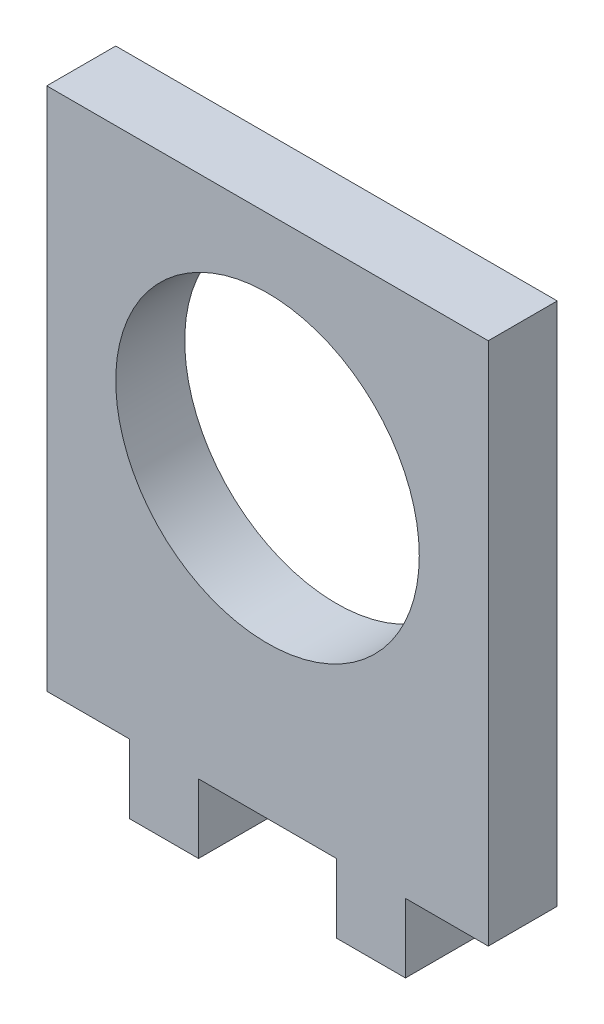
ISO-10303-21;
HEADER;
FILE_DESCRIPTION(('STEP AP214'),'2;1');
FILE_NAME('part.step','',(''),(''),'','','');
FILE_SCHEMA(('AUTOMOTIVE_DESIGN { 1 0 10303 214 1 1 1 1 }'));
ENDSEC;
DATA;
#1=APPLICATION_CONTEXT('core data for automotive mechanical design processes');
#2=APPLICATION_PROTOCOL_DEFINITION('international standard','automotive_design',2000,#1);
#3=PRODUCT_CONTEXT('',#1,'mechanical');
#4=PRODUCT('Part','Part','',(#3));
#5=PRODUCT_RELATED_PRODUCT_CATEGORY('part','',(#4));
#6=PRODUCT_DEFINITION_FORMATION('','',#4);
#7=PRODUCT_DEFINITION_CONTEXT('part definition',#1,'design');
#8=PRODUCT_DEFINITION('design','',#6,#7);
#9=PRODUCT_DEFINITION_SHAPE('','',#8);
#10=(LENGTH_UNIT() NAMED_UNIT(*) SI_UNIT(.MILLI.,.METRE.));
#11=(NAMED_UNIT(*) PLANE_ANGLE_UNIT() SI_UNIT($,.RADIAN.));
#12=(NAMED_UNIT(*) SI_UNIT($,.STERADIAN.) SOLID_ANGLE_UNIT());
#13=UNCERTAINTY_MEASURE_WITH_UNIT(LENGTH_MEASURE(1.E-05),#10,'distance_accuracy_value','');
#14=(GEOMETRIC_REPRESENTATION_CONTEXT(3) GLOBAL_UNCERTAINTY_ASSIGNED_CONTEXT((#13)) GLOBAL_UNIT_ASSIGNED_CONTEXT((#10,
#11,#12)) REPRESENTATION_CONTEXT('',''));
#15=CARTESIAN_POINT('',(0.,0.,0.));
#16=DIRECTION('',(0.,0.,1.));
#17=DIRECTION('',(1.,0.,0.));
#18=AXIS2_PLACEMENT_3D('',#15,#16,#17);
#19=CARTESIAN_POINT('',(0.,-27.,5.));
#20=DIRECTION('',(0.,1.,0.));
#21=DIRECTION('',(0.,0.,1.));
#22=AXIS2_PLACEMENT_3D('',#19,#20,#21);
#23=PLANE('',#22);
#24=DIRECTION('',(1.,0.,0.));
#25=VECTOR('',#24,1.);
#26=CARTESIAN_POINT('',(0.,-27.,0.));
#27=LINE('',#26,#25);
#28=CARTESIAN_POINT('',(5.,-27.,0.));
#29=VERTEX_POINT('',#28);
#30=CARTESIAN_POINT('',(10.,-27.,0.));
#31=VERTEX_POINT('',#30);
#32=EDGE_CURVE('E207',#29,#31,#27,.T.);
#33=ORIENTED_EDGE('',*,*,#32,.T.);
#34=DIRECTION('',(0.,0.,-1.));
#35=VECTOR('',#34,1.);
#36=CARTESIAN_POINT('',(10.,-27.,5.));
#37=LINE('',#36,#35);
#38=CARTESIAN_POINT('',(10.,-27.,5.));
#39=VERTEX_POINT('',#38);
#40=EDGE_CURVE('E11',#39,#31,#37,.T.);
#41=ORIENTED_EDGE('',*,*,#40,.F.);
#42=DIRECTION('',(1.,0.,0.));
#43=VECTOR('',#42,1.);
#44=CARTESIAN_POINT('',(0.,-27.,5.));
#45=LINE('',#44,#43);
#46=CARTESIAN_POINT('',(5.,-27.,5.));
#47=VERTEX_POINT('',#46);
#48=EDGE_CURVE('E162',#47,#39,#45,.T.);
#49=ORIENTED_EDGE('',*,*,#48,.F.);
#50=DIRECTION('',(0.,0.,-1.));
#51=VECTOR('',#50,1.);
#52=CARTESIAN_POINT('',(5.,-27.,5.));
#53=LINE('',#52,#51);
#54=EDGE_CURVE('E174',#47,#29,#53,.T.);
#55=ORIENTED_EDGE('',*,*,#54,.T.);
#56=EDGE_LOOP('',(#33,#41,#49,#55));
#57=FACE_BOUND('',#56,.T.);
#58=ADVANCED_FACE('F33',(#57),#23,.F.);
#59=CARTESIAN_POINT('',(10.,0.,5.));
#60=DIRECTION('',(-1.,0.,0.));
#61=DIRECTION('',(0.,0.,1.));
#62=AXIS2_PLACEMENT_3D('',#59,#60,#61);
#63=PLANE('',#62);
#64=DIRECTION('',(0.,1.,0.));
#65=VECTOR('',#64,1.);
#66=CARTESIAN_POINT('',(10.,0.,0.));
#67=LINE('',#66,#65);
#68=CARTESIAN_POINT('',(10.,-22.,0.));
#69=VERTEX_POINT('',#68);
#70=EDGE_CURVE('E199',#31,#69,#67,.T.);
#71=ORIENTED_EDGE('',*,*,#70,.T.);
#72=DIRECTION('',(0.,0.,-1.));
#73=VECTOR('',#72,1.);
#74=CARTESIAN_POINT('',(10.,-22.,5.));
#75=LINE('',#74,#73);
#76=CARTESIAN_POINT('',(10.,-22.,5.));
#77=VERTEX_POINT('',#76);
#78=EDGE_CURVE('E41',#77,#69,#75,.T.);
#79=ORIENTED_EDGE('',*,*,#78,.F.);
#80=DIRECTION('',(0.,1.,0.));
#81=VECTOR('',#80,1.);
#82=CARTESIAN_POINT('',(10.,0.,5.));
#83=LINE('',#82,#81);
#84=EDGE_CURVE('E104',#39,#77,#83,.T.);
#85=ORIENTED_EDGE('',*,*,#84,.F.);
#86=ORIENTED_EDGE('',*,*,#40,.T.);
#87=EDGE_LOOP('',(#71,#79,#85,#86));
#88=FACE_BOUND('',#87,.T.);
#89=ADVANCED_FACE('F259',(#88),#63,.F.);
#90=CARTESIAN_POINT('',(0.,-22.,5.));
#91=DIRECTION('',(0.,1.,0.));
#92=DIRECTION('',(0.,0.,1.));
#93=AXIS2_PLACEMENT_3D('',#90,#91,#92);
#94=PLANE('',#93);
#95=DIRECTION('',(1.,0.,0.));
#96=VECTOR('',#95,1.);
#97=CARTESIAN_POINT('',(0.,-22.,0.));
#98=LINE('',#97,#96);
#99=CARTESIAN_POINT('',(16.,-22.,0.));
#100=VERTEX_POINT('',#99);
#101=EDGE_CURVE('E194',#69,#100,#98,.T.);
#102=ORIENTED_EDGE('',*,*,#101,.T.);
#103=DIRECTION('',(0.,0.,-1.));
#104=VECTOR('',#103,1.);
#105=CARTESIAN_POINT('',(16.,-22.,5.));
#106=LINE('',#105,#104);
#107=CARTESIAN_POINT('',(16.,-22.,5.));
#108=VERTEX_POINT('',#107);
#109=EDGE_CURVE('E188',#108,#100,#106,.T.);
#110=ORIENTED_EDGE('',*,*,#109,.F.);
#111=DIRECTION('',(1.,0.,0.));
#112=VECTOR('',#111,1.);
#113=CARTESIAN_POINT('',(0.,-22.,5.));
#114=LINE('',#113,#112);
#115=EDGE_CURVE('E151',#77,#108,#114,.T.);
#116=ORIENTED_EDGE('',*,*,#115,.F.);
#117=ORIENTED_EDGE('',*,*,#78,.T.);
#118=EDGE_LOOP('',(#102,#110,#116,#117));
#119=FACE_BOUND('',#118,.T.);
#120=ADVANCED_FACE('F193',(#119),#94,.F.);
#121=CARTESIAN_POINT('',(16.,0.,5.));
#122=DIRECTION('',(-1.,0.,0.));
#123=DIRECTION('',(0.,0.,1.));
#124=AXIS2_PLACEMENT_3D('',#121,#122,#123);
#125=PLANE('',#124);
#126=DIRECTION('',(0.,1.,0.));
#127=VECTOR('',#126,1.);
#128=CARTESIAN_POINT('',(16.,0.,0.));
#129=LINE('',#128,#127);
#130=CARTESIAN_POINT('',(16.,16.,0.));
#131=VERTEX_POINT('',#130);
#132=EDGE_CURVE('E202',#100,#131,#129,.T.);
#133=ORIENTED_EDGE('',*,*,#132,.T.);
#134=DIRECTION('',(0.,0.,-1.));
#135=VECTOR('',#134,1.);
#136=CARTESIAN_POINT('',(16.,16.,5.));
#137=LINE('',#136,#135);
#138=CARTESIAN_POINT('',(16.,16.,5.));
#139=VERTEX_POINT('',#138);
#140=EDGE_CURVE('E186',#139,#131,#137,.T.);
#141=ORIENTED_EDGE('',*,*,#140,.F.);
#142=DIRECTION('',(0.,1.,0.));
#143=VECTOR('',#142,1.);
#144=CARTESIAN_POINT('',(16.,0.,5.));
#145=LINE('',#144,#143);
#146=EDGE_CURVE('E158',#108,#139,#145,.T.);
#147=ORIENTED_EDGE('',*,*,#146,.F.);
#148=ORIENTED_EDGE('',*,*,#109,.T.);
#149=EDGE_LOOP('',(#133,#141,#147,#148));
#150=FACE_BOUND('',#149,.T.);
#151=ADVANCED_FACE('F266',(#150),#125,.F.);
#152=CARTESIAN_POINT('',(0.,16.,5.));
#153=DIRECTION('',(0.,1.,0.));
#154=DIRECTION('',(0.,0.,1.));
#155=AXIS2_PLACEMENT_3D('',#152,#153,#154);
#156=PLANE('',#155);
#157=DIRECTION('',(1.,0.,0.));
#158=VECTOR('',#157,1.);
#159=CARTESIAN_POINT('',(0.,16.,0.));
#160=LINE('',#159,#158);
#161=CARTESIAN_POINT('',(-16.,16.,0.));
#162=VERTEX_POINT('',#161);
#163=EDGE_CURVE('E205',#162,#131,#160,.T.);
#164=ORIENTED_EDGE('',*,*,#163,.F.);
#165=DIRECTION('',(0.,0.,-1.));
#166=VECTOR('',#165,1.);
#167=CARTESIAN_POINT('',(-16.,16.,5.));
#168=LINE('',#167,#166);
#169=CARTESIAN_POINT('',(-16.,16.,5.));
#170=VERTEX_POINT('',#169);
#171=EDGE_CURVE('E184',#170,#162,#168,.T.);
#172=ORIENTED_EDGE('',*,*,#171,.F.);
#173=DIRECTION('',(1.,0.,0.));
#174=VECTOR('',#173,1.);
#175=CARTESIAN_POINT('',(0.,16.,5.));
#176=LINE('',#175,#174);
#177=EDGE_CURVE('E161',#170,#139,#176,.T.);
#178=ORIENTED_EDGE('',*,*,#177,.T.);
#179=ORIENTED_EDGE('',*,*,#140,.T.);
#180=EDGE_LOOP('',(#164,#172,#178,#179));
#181=FACE_BOUND('',#180,.T.);
#182=ADVANCED_FACE('F270',(#181),#156,.T.);
#183=CARTESIAN_POINT('',(-16.,0.,5.));
#184=DIRECTION('',(-1.,0.,0.));
#185=DIRECTION('',(0.,0.,1.));
#186=AXIS2_PLACEMENT_3D('',#183,#184,#185);
#187=PLANE('',#186);
#188=DIRECTION('',(0.,1.,0.));
#189=VECTOR('',#188,1.);
#190=CARTESIAN_POINT('',(-16.,0.,0.));
#191=LINE('',#190,#189);
#192=CARTESIAN_POINT('',(-16.,-22.,0.));
#193=VERTEX_POINT('',#192);
#194=EDGE_CURVE('E211',#193,#162,#191,.T.);
#195=ORIENTED_EDGE('',*,*,#194,.F.);
#196=DIRECTION('',(0.,0.,-1.));
#197=VECTOR('',#196,1.);
#198=CARTESIAN_POINT('',(-16.,-22.,5.));
#199=LINE('',#198,#197);
#200=CARTESIAN_POINT('',(-16.,-22.,5.));
#201=VERTEX_POINT('',#200);
#202=EDGE_CURVE('E182',#201,#193,#199,.T.);
#203=ORIENTED_EDGE('',*,*,#202,.F.);
#204=DIRECTION('',(0.,1.,0.));
#205=VECTOR('',#204,1.);
#206=CARTESIAN_POINT('',(-16.,0.,5.));
#207=LINE('',#206,#205);
#208=EDGE_CURVE('E157',#201,#170,#207,.T.);
#209=ORIENTED_EDGE('',*,*,#208,.T.);
#210=ORIENTED_EDGE('',*,*,#171,.T.);
#211=EDGE_LOOP('',(#195,#203,#209,#210));
#212=FACE_BOUND('',#211,.T.);
#213=ADVANCED_FACE('F274',(#212),#187,.T.);
#214=CARTESIAN_POINT('',(-10.,-22.,0.));
#215=VERTEX_POINT('',#214);
#216=EDGE_CURVE('E204',#193,#215,#98,.T.);
#217=ORIENTED_EDGE('',*,*,#216,.T.);
#218=DIRECTION('',(0.,0.,-1.));
#219=VECTOR('',#218,1.);
#220=CARTESIAN_POINT('',(-10.,-22.,5.));
#221=LINE('',#220,#219);
#222=CARTESIAN_POINT('',(-10.,-22.,5.));
#223=VERTEX_POINT('',#222);
#224=EDGE_CURVE('E180',#223,#215,#221,.T.);
#225=ORIENTED_EDGE('',*,*,#224,.F.);
#226=EDGE_CURVE('E150',#201,#223,#114,.T.);
#227=ORIENTED_EDGE('',*,*,#226,.F.);
#228=ORIENTED_EDGE('',*,*,#202,.T.);
#229=EDGE_LOOP('',(#217,#225,#227,#228));
#230=FACE_BOUND('',#229,.T.);
#231=ADVANCED_FACE('F232',(#230),#94,.F.);
#232=CARTESIAN_POINT('',(-10.,0.,5.));
#233=DIRECTION('',(-1.,0.,0.));
#234=DIRECTION('',(0.,0.,1.));
#235=AXIS2_PLACEMENT_3D('',#232,#233,#234);
#236=PLANE('',#235);
#237=DIRECTION('',(0.,1.,0.));
#238=VECTOR('',#237,1.);
#239=CARTESIAN_POINT('',(-10.,0.,0.));
#240=LINE('',#239,#238);
#241=CARTESIAN_POINT('',(-10.,-27.,0.));
#242=VERTEX_POINT('',#241);
#243=EDGE_CURVE('E210',#242,#215,#240,.T.);
#244=ORIENTED_EDGE('',*,*,#243,.F.);
#245=DIRECTION('',(0.,0.,-1.));
#246=VECTOR('',#245,1.);
#247=CARTESIAN_POINT('',(-10.,-27.,5.));
#248=LINE('',#247,#246);
#249=CARTESIAN_POINT('',(-10.,-27.,5.));
#250=VERTEX_POINT('',#249);
#251=EDGE_CURVE('E178',#250,#242,#248,.T.);
#252=ORIENTED_EDGE('',*,*,#251,.F.);
#253=DIRECTION('',(0.,1.,0.));
#254=VECTOR('',#253,1.);
#255=CARTESIAN_POINT('',(-10.,0.,5.));
#256=LINE('',#255,#254);
#257=EDGE_CURVE('E156',#250,#223,#256,.T.);
#258=ORIENTED_EDGE('',*,*,#257,.T.);
#259=ORIENTED_EDGE('',*,*,#224,.T.);
#260=EDGE_LOOP('',(#244,#252,#258,#259));
#261=FACE_BOUND('',#260,.T.);
#262=ADVANCED_FACE('F230',(#261),#236,.T.);
#263=CARTESIAN_POINT('',(0.,-27.,5.));
#264=DIRECTION('',(0.,-1.,0.));
#265=DIRECTION('',(0.,0.,-1.));
#266=AXIS2_PLACEMENT_3D('',#263,#264,#265);
#267=PLANE('',#266);
#268=DIRECTION('',(-1.,0.,0.));
#269=VECTOR('',#268,1.);
#270=CARTESIAN_POINT('',(0.,-27.,0.));
#271=LINE('',#270,#269);
#272=CARTESIAN_POINT('',(-5.,-27.,0.));
#273=VERTEX_POINT('',#272);
#274=EDGE_CURVE('E216',#273,#242,#271,.T.);
#275=ORIENTED_EDGE('',*,*,#274,.F.);
#276=DIRECTION('',(0.,0.,-1.));
#277=VECTOR('',#276,1.);
#278=CARTESIAN_POINT('',(-5.,-27.,5.));
#279=LINE('',#278,#277);
#280=CARTESIAN_POINT('',(-5.,-27.,5.));
#281=VERTEX_POINT('',#280);
#282=EDGE_CURVE('E145',#281,#273,#279,.T.);
#283=ORIENTED_EDGE('',*,*,#282,.F.);
#284=DIRECTION('',(-1.,0.,0.));
#285=VECTOR('',#284,1.);
#286=CARTESIAN_POINT('',(0.,-27.,5.));
#287=LINE('',#286,#285);
#288=EDGE_CURVE('E138',#281,#250,#287,.T.);
#289=ORIENTED_EDGE('',*,*,#288,.T.);
#290=ORIENTED_EDGE('',*,*,#251,.T.);
#291=EDGE_LOOP('',(#275,#283,#289,#290));
#292=FACE_BOUND('',#291,.T.);
#293=ADVANCED_FACE('F227',(#292),#267,.T.);
#294=CARTESIAN_POINT('',(-5.,0.,5.));
#295=DIRECTION('',(-1.,0.,0.));
#296=DIRECTION('',(0.,-1.,0.));
#297=AXIS2_PLACEMENT_3D('',#294,#295,#296);
#298=PLANE('',#297);
#299=DIRECTION('',(0.,1.,0.));
#300=VECTOR('',#299,1.);
#301=CARTESIAN_POINT('',(-5.,0.,0.));
#302=LINE('',#301,#300);
#303=CARTESIAN_POINT('',(-5.,-22.,0.));
#304=VERTEX_POINT('',#303);
#305=EDGE_CURVE('E144',#273,#304,#302,.T.);
#306=ORIENTED_EDGE('',*,*,#305,.T.);
#307=DIRECTION('',(0.,0.,-1.));
#308=VECTOR('',#307,1.);
#309=CARTESIAN_POINT('',(-5.,-22.,5.));
#310=LINE('',#309,#308);
#311=CARTESIAN_POINT('',(-5.,-22.,5.));
#312=VERTEX_POINT('',#311);
#313=EDGE_CURVE('E141',#312,#304,#310,.T.);
#314=ORIENTED_EDGE('',*,*,#313,.F.);
#315=DIRECTION('',(0.,1.,0.));
#316=VECTOR('',#315,1.);
#317=CARTESIAN_POINT('',(-5.,0.,5.));
#318=LINE('',#317,#316);
#319=EDGE_CURVE('E130',#281,#312,#318,.T.);
#320=ORIENTED_EDGE('',*,*,#319,.F.);
#321=ORIENTED_EDGE('',*,*,#282,.T.);
#322=EDGE_LOOP('',(#306,#314,#320,#321));
#323=FACE_BOUND('',#322,.T.);
#324=ADVANCED_FACE('F142',(#323),#298,.F.);
#325=CARTESIAN_POINT('',(5.,-22.,0.));
#326=VERTEX_POINT('',#325);
#327=EDGE_CURVE('E90',#304,#326,#98,.T.);
#328=ORIENTED_EDGE('',*,*,#327,.T.);
#329=DIRECTION('',(0.,0.,-1.));
#330=VECTOR('',#329,1.);
#331=CARTESIAN_POINT('',(5.,-22.,5.));
#332=LINE('',#331,#330);
#333=CARTESIAN_POINT('',(5.,-22.,5.));
#334=VERTEX_POINT('',#333);
#335=EDGE_CURVE('E146',#334,#326,#332,.T.);
#336=ORIENTED_EDGE('',*,*,#335,.F.);
#337=EDGE_CURVE('E135',#312,#334,#114,.T.);
#338=ORIENTED_EDGE('',*,*,#337,.F.);
#339=ORIENTED_EDGE('',*,*,#313,.T.);
#340=EDGE_LOOP('',(#328,#336,#338,#339));
#341=FACE_BOUND('',#340,.T.);
#342=ADVANCED_FACE('F148',(#341),#94,.F.);
#343=CARTESIAN_POINT('',(5.,0.,5.));
#344=DIRECTION('',(1.,0.,0.));
#345=DIRECTION('',(0.,1.,0.));
#346=AXIS2_PLACEMENT_3D('',#343,#344,#345);
#347=PLANE('',#346);
#348=DIRECTION('',(0.,-1.,0.));
#349=VECTOR('',#348,1.);
#350=CARTESIAN_POINT('',(5.,0.,0.));
#351=LINE('',#350,#349);
#352=EDGE_CURVE('E96',#326,#29,#351,.T.);
#353=ORIENTED_EDGE('',*,*,#352,.T.);
#354=ORIENTED_EDGE('',*,*,#54,.F.);
#355=DIRECTION('',(0.,-1.,0.));
#356=VECTOR('',#355,1.);
#357=CARTESIAN_POINT('',(5.,0.,5.));
#358=LINE('',#357,#356);
#359=EDGE_CURVE('E49',#334,#47,#358,.T.);
#360=ORIENTED_EDGE('',*,*,#359,.F.);
#361=ORIENTED_EDGE('',*,*,#335,.T.);
#362=EDGE_LOOP('',(#353,#354,#360,#361));
#363=FACE_BOUND('',#362,.T.);
#364=ADVANCED_FACE('F247',(#363),#347,.F.);
#365=CARTESIAN_POINT('',(0.,0.,5.));
#366=DIRECTION('',(0.,0.,-1.));
#367=DIRECTION('',(-1.,0.,0.));
#368=AXIS2_PLACEMENT_3D('',#365,#366,#367);
#369=CYLINDRICAL_SURFACE('',#368,11.);
#370=CARTESIAN_POINT('',(0.,0.,5.));
#371=DIRECTION('',(0.,0.,1.));
#372=DIRECTION('',(1.,0.,0.));
#373=AXIS2_PLACEMENT_3D('',#370,#371,#372);
#374=CIRCLE('',#373,11.);
#375=CARTESIAN_POINT('',(11.,0.,5.));
#376=VERTEX_POINT('',#375);
#377=EDGE_CURVE('E152',#376,#376,#374,.T.);
#378=ORIENTED_EDGE('',*,*,#377,.T.);
#379=EDGE_LOOP('',(#378));
#380=FACE_BOUND('',#379,.T.);
#381=CARTESIAN_POINT('',(0.,0.,0.));
#382=DIRECTION('',(0.,0.,1.));
#383=DIRECTION('',(1.,0.,0.));
#384=AXIS2_PLACEMENT_3D('',#381,#382,#383);
#385=CIRCLE('',#384,11.);
#386=CARTESIAN_POINT('',(11.,0.,0.));
#387=VERTEX_POINT('',#386);
#388=EDGE_CURVE('E163',#387,#387,#385,.T.);
#389=ORIENTED_EDGE('',*,*,#388,.F.);
#390=EDGE_LOOP('',(#389));
#391=FACE_BOUND('',#390,.T.);
#392=ADVANCED_FACE('F249',(#380,#391),#369,.F.);
#393=CARTESIAN_POINT('',(0.,0.,5.));
#394=DIRECTION('',(0.,0.,1.));
#395=DIRECTION('',(1.,0.,0.));
#396=AXIS2_PLACEMENT_3D('',#393,#394,#395);
#397=PLANE('',#396);
#398=ORIENTED_EDGE('',*,*,#48,.T.);
#399=ORIENTED_EDGE('',*,*,#84,.T.);
#400=ORIENTED_EDGE('',*,*,#115,.T.);
#401=ORIENTED_EDGE('',*,*,#146,.T.);
#402=ORIENTED_EDGE('',*,*,#177,.F.);
#403=ORIENTED_EDGE('',*,*,#208,.F.);
#404=ORIENTED_EDGE('',*,*,#226,.T.);
#405=ORIENTED_EDGE('',*,*,#257,.F.);
#406=ORIENTED_EDGE('',*,*,#288,.F.);
#407=ORIENTED_EDGE('',*,*,#319,.T.);
#408=ORIENTED_EDGE('',*,*,#337,.T.);
#409=ORIENTED_EDGE('',*,*,#359,.T.);
#410=EDGE_LOOP('',(#398,#399,#400,#401,#402,#403,#404,#405,#406,#407,#408,#409));
#411=FACE_BOUND('',#410,.T.);
#412=ORIENTED_EDGE('',*,*,#377,.F.);
#413=EDGE_LOOP('',(#412));
#414=FACE_BOUND('',#413,.T.);
#415=ADVANCED_FACE('F132',(#411,#414),#397,.T.);
#416=CARTESIAN_POINT('',(0.,0.,0.));
#417=DIRECTION('',(0.,0.,1.));
#418=DIRECTION('',(1.,0.,0.));
#419=AXIS2_PLACEMENT_3D('',#416,#417,#418);
#420=PLANE('',#419);
#421=ORIENTED_EDGE('',*,*,#32,.F.);
#422=ORIENTED_EDGE('',*,*,#352,.F.);
#423=ORIENTED_EDGE('',*,*,#327,.F.);
#424=ORIENTED_EDGE('',*,*,#305,.F.);
#425=ORIENTED_EDGE('',*,*,#274,.T.);
#426=ORIENTED_EDGE('',*,*,#243,.T.);
#427=ORIENTED_EDGE('',*,*,#216,.F.);
#428=ORIENTED_EDGE('',*,*,#194,.T.);
#429=ORIENTED_EDGE('',*,*,#163,.T.);
#430=ORIENTED_EDGE('',*,*,#132,.F.);
#431=ORIENTED_EDGE('',*,*,#101,.F.);
#432=ORIENTED_EDGE('',*,*,#70,.F.);
#433=EDGE_LOOP('',(#421,#422,#423,#424,#425,#426,#427,#428,#429,#430,#431,#432));
#434=FACE_BOUND('',#433,.T.);
#435=ORIENTED_EDGE('',*,*,#388,.T.);
#436=EDGE_LOOP('',(#435));
#437=FACE_BOUND('',#436,.T.);
#438=ADVANCED_FACE('F198',(#434,#437),#420,.F.);
#439=CLOSED_SHELL('',(#58,#89,#120,#151,#182,#213,#231,#262,#293,#324,#342,#364,#392,#415,#438));
#440=MANIFOLD_SOLID_BREP('B2',#439);
#441=ADVANCED_BREP_SHAPE_REPRESENTATION('',(#18,#440),#14);
#442=SHAPE_DEFINITION_REPRESENTATION(#9,#441);
ENDSEC;
END-ISO-10303-21;
